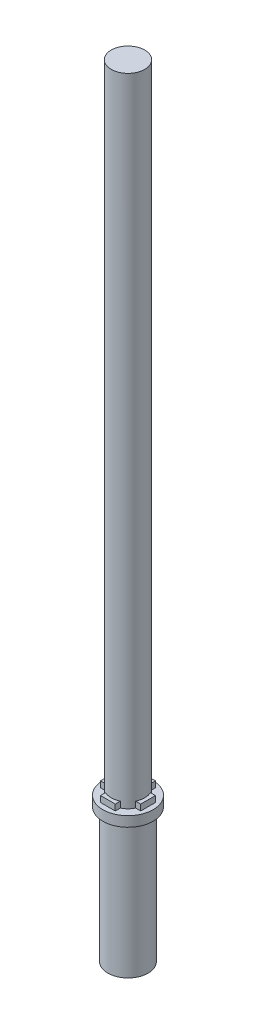
ISO-10303-21;
HEADER;
FILE_DESCRIPTION(('STEP AP214'),'2;1');
FILE_NAME('part.step','',(''),(''),'','','');
FILE_SCHEMA(('AUTOMOTIVE_DESIGN { 1 0 10303 214 1 1 1 1 }'));
ENDSEC;
DATA;
#1=APPLICATION_CONTEXT('core data for automotive mechanical design processes');
#2=APPLICATION_PROTOCOL_DEFINITION('international standard','automotive_design',2000,#1);
#3=PRODUCT_CONTEXT('',#1,'mechanical');
#4=PRODUCT('Part','Part','',(#3));
#5=PRODUCT_RELATED_PRODUCT_CATEGORY('part','',(#4));
#6=PRODUCT_DEFINITION_FORMATION('','',#4);
#7=PRODUCT_DEFINITION_CONTEXT('part definition',#1,'design');
#8=PRODUCT_DEFINITION('design','',#6,#7);
#9=PRODUCT_DEFINITION_SHAPE('','',#8);
#10=(LENGTH_UNIT() NAMED_UNIT(*) SI_UNIT(.MILLI.,.METRE.));
#11=(NAMED_UNIT(*) PLANE_ANGLE_UNIT() SI_UNIT($,.RADIAN.));
#12=(NAMED_UNIT(*) SI_UNIT($,.STERADIAN.) SOLID_ANGLE_UNIT());
#13=UNCERTAINTY_MEASURE_WITH_UNIT(LENGTH_MEASURE(1.E-05),#10,'distance_accuracy_value','');
#14=(GEOMETRIC_REPRESENTATION_CONTEXT(3) GLOBAL_UNCERTAINTY_ASSIGNED_CONTEXT((#13)) GLOBAL_UNIT_ASSIGNED_CONTEXT((#10,
#11,#12)) REPRESENTATION_CONTEXT('',''));
#15=CARTESIAN_POINT('',(0.,0.,0.));
#16=DIRECTION('',(0.,0.,1.));
#17=DIRECTION('',(1.,0.,0.));
#18=AXIS2_PLACEMENT_3D('',#15,#16,#17);
#19=CARTESIAN_POINT('',(0.,0.,0.));
#20=DIRECTION('',(0.,1.,0.));
#21=DIRECTION('',(0.,0.,1.));
#22=AXIS2_PLACEMENT_3D('',#19,#20,#21);
#23=PLANE('',#22);
#24=CARTESIAN_POINT('',(0.,0.,0.));
#25=DIRECTION('',(0.,1.,0.));
#26=DIRECTION('',(0.,0.,1.));
#27=AXIS2_PLACEMENT_3D('',#24,#25,#26);
#28=CIRCLE('',#27,6.);
#29=CARTESIAN_POINT('',(0.,0.,6.));
#30=VERTEX_POINT('',#29);
#31=EDGE_CURVE('E57',#30,#30,#28,.T.);
#32=ORIENTED_EDGE('',*,*,#31,.F.);
#33=EDGE_LOOP('',(#32));
#34=FACE_BOUND('',#33,.T.);
#35=CARTESIAN_POINT('',(0.,0.,0.));
#36=DIRECTION('',(0.,1.,0.));
#37=DIRECTION('',(0.,0.,1.));
#38=AXIS2_PLACEMENT_3D('',#35,#36,#37);
#39=CIRCLE('',#38,5.25);
#40=CARTESIAN_POINT('',(0.,0.,5.25));
#41=VERTEX_POINT('',#40);
#42=EDGE_CURVE('E352',#41,#41,#39,.T.);
#43=ORIENTED_EDGE('',*,*,#42,.T.);
#44=EDGE_LOOP('',(#43));
#45=FACE_BOUND('',#44,.T.);
#46=ADVANCED_FACE('F53',(#34,#45),#23,.F.);
#47=CARTESIAN_POINT('',(0.,40.,0.));
#48=DIRECTION('',(0.,-1.,0.));
#49=DIRECTION('',(0.,0.,-1.));
#50=AXIS2_PLACEMENT_3D('',#47,#48,#49);
#51=CYLINDRICAL_SURFACE('',#50,6.);
#52=CARTESIAN_POINT('',(0.,40.,0.));
#53=DIRECTION('',(0.,1.,0.));
#54=DIRECTION('',(0.,0.,1.));
#55=AXIS2_PLACEMENT_3D('',#52,#53,#54);
#56=CIRCLE('',#55,6.);
#57=CARTESIAN_POINT('',(0.,40.,6.));
#58=VERTEX_POINT('',#57);
#59=EDGE_CURVE('E355',#58,#58,#56,.T.);
#60=ORIENTED_EDGE('',*,*,#59,.F.);
#61=EDGE_LOOP('',(#60));
#62=FACE_BOUND('',#61,.T.);
#63=ORIENTED_EDGE('',*,*,#31,.T.);
#64=EDGE_LOOP('',(#63));
#65=FACE_BOUND('',#64,.T.);
#66=ADVANCED_FACE('F55',(#62,#65),#51,.T.);
#67=CARTESIAN_POINT('',(0.,40.,0.));
#68=DIRECTION('',(0.,-1.,0.));
#69=DIRECTION('',(0.,0.,-1.));
#70=AXIS2_PLACEMENT_3D('',#67,#68,#69);
#71=CYLINDRICAL_SURFACE('',#70,5.25);
#72=CARTESIAN_POINT('',(0.,40.,0.));
#73=DIRECTION('',(0.,1.,0.));
#74=DIRECTION('',(0.,0.,1.));
#75=AXIS2_PLACEMENT_3D('',#72,#73,#74);
#76=CIRCLE('',#75,5.25);
#77=CARTESIAN_POINT('',(0.,40.,5.25));
#78=VERTEX_POINT('',#77);
#79=EDGE_CURVE('E345',#78,#78,#76,.T.);
#80=ORIENTED_EDGE('',*,*,#79,.T.);
#81=EDGE_LOOP('',(#80));
#82=FACE_BOUND('',#81,.T.);
#83=ORIENTED_EDGE('',*,*,#42,.F.);
#84=EDGE_LOOP('',(#83));
#85=FACE_BOUND('',#84,.T.);
#86=ADVANCED_FACE('F372',(#82,#85),#71,.F.);
#87=CARTESIAN_POINT('',(0.,40.,0.));
#88=DIRECTION('',(0.,1.,0.));
#89=DIRECTION('',(0.,0.,1.));
#90=AXIS2_PLACEMENT_3D('',#87,#88,#89);
#91=PLANE('',#90);
#92=ORIENTED_EDGE('',*,*,#79,.F.);
#93=EDGE_LOOP('',(#92));
#94=FACE_BOUND('',#93,.T.);
#95=ADVANCED_FACE('F374',(#94),#91,.F.);
#96=CARTESIAN_POINT('',(0.,43.,0.));
#97=DIRECTION('',(0.,-1.,0.));
#98=DIRECTION('',(0.,0.,-1.));
#99=AXIS2_PLACEMENT_3D('',#96,#97,#98);
#100=CYLINDRICAL_SURFACE('',#99,7.5);
#101=CARTESIAN_POINT('',(0.,43.,0.));
#102=DIRECTION('',(0.,1.,0.));
#103=DIRECTION('',(0.,0.,1.));
#104=AXIS2_PLACEMENT_3D('',#101,#102,#103);
#105=CIRCLE('',#104,7.5);
#106=CARTESIAN_POINT('',(0.,43.,7.5));
#107=VERTEX_POINT('',#106);
#108=EDGE_CURVE('E341',#107,#107,#105,.T.);
#109=ORIENTED_EDGE('',*,*,#108,.F.);
#110=EDGE_LOOP('',(#109));
#111=FACE_BOUND('',#110,.T.);
#112=CARTESIAN_POINT('',(0.,40.,0.));
#113=DIRECTION('',(0.,1.,0.));
#114=DIRECTION('',(0.,0.,1.));
#115=AXIS2_PLACEMENT_3D('',#112,#113,#114);
#116=CIRCLE('',#115,7.5);
#117=CARTESIAN_POINT('',(0.,40.,7.5));
#118=VERTEX_POINT('',#117);
#119=EDGE_CURVE('E339',#118,#118,#116,.T.);
#120=ORIENTED_EDGE('',*,*,#119,.T.);
#121=EDGE_LOOP('',(#120));
#122=FACE_BOUND('',#121,.T.);
#123=ADVANCED_FACE('F381',(#111,#122),#100,.T.);
#124=CARTESIAN_POINT('',(0.,43.,0.));
#125=DIRECTION('',(0.,1.,0.));
#126=DIRECTION('',(0.,0.,1.));
#127=AXIS2_PLACEMENT_3D('',#124,#125,#126);
#128=PLANE('',#127);
#129=DIRECTION('',(-1.,0.,0.));
#130=VECTOR('',#129,1.);
#131=CARTESIAN_POINT('',(0.,43.,2.2));
#132=LINE('',#131,#130);
#133=CARTESIAN_POINT('',(6.,43.,2.2));
#134=VERTEX_POINT('',#133);
#135=CARTESIAN_POINT('',(4.48998886412873,43.,2.2));
#136=VERTEX_POINT('',#135);
#137=EDGE_CURVE('E178',#134,#136,#132,.T.);
#138=ORIENTED_EDGE('',*,*,#137,.T.);
#139=CARTESIAN_POINT('',(0.,43.,0.));
#140=DIRECTION('',(0.,1.,0.));
#141=DIRECTION('',(0.,0.,1.));
#142=AXIS2_PLACEMENT_3D('',#139,#140,#141);
#143=CIRCLE('',#142,5.);
#144=CARTESIAN_POINT('',(2.2,43.,4.48998886412873));
#145=VERTEX_POINT('',#144);
#146=EDGE_CURVE('E12',#145,#136,#143,.T.);
#147=ORIENTED_EDGE('',*,*,#146,.F.);
#148=DIRECTION('',(0.,0.,1.));
#149=VECTOR('',#148,1.);
#150=CARTESIAN_POINT('',(2.2,43.,0.));
#151=LINE('',#150,#149);
#152=CARTESIAN_POINT('',(2.2,43.,6.));
#153=VERTEX_POINT('',#152);
#154=EDGE_CURVE('E225',#145,#153,#151,.T.);
#155=ORIENTED_EDGE('',*,*,#154,.T.);
#156=DIRECTION('',(-1.,0.,0.));
#157=VECTOR('',#156,1.);
#158=CARTESIAN_POINT('',(0.,43.,6.));
#159=LINE('',#158,#157);
#160=CARTESIAN_POINT('',(-2.2,43.,6.));
#161=VERTEX_POINT('',#160);
#162=EDGE_CURVE('E239',#153,#161,#159,.T.);
#163=ORIENTED_EDGE('',*,*,#162,.T.);
#164=DIRECTION('',(0.,0.,-1.));
#165=VECTOR('',#164,1.);
#166=CARTESIAN_POINT('',(-2.2,43.,0.));
#167=LINE('',#166,#165);
#168=CARTESIAN_POINT('',(-2.2,43.,4.48998886412873));
#169=VERTEX_POINT('',#168);
#170=EDGE_CURVE('E235',#161,#169,#167,.T.);
#171=ORIENTED_EDGE('',*,*,#170,.T.);
#172=CARTESIAN_POINT('',(-4.48998886412873,43.,2.2));
#173=VERTEX_POINT('',#172);
#174=EDGE_CURVE('E65',#173,#169,#143,.T.);
#175=ORIENTED_EDGE('',*,*,#174,.F.);
#176=DIRECTION('',(-1.,0.,0.));
#177=VECTOR('',#176,1.);
#178=CARTESIAN_POINT('',(0.,43.,2.2));
#179=LINE('',#178,#177);
#180=CARTESIAN_POINT('',(-6.,43.,2.2));
#181=VERTEX_POINT('',#180);
#182=EDGE_CURVE('E303',#173,#181,#179,.T.);
#183=ORIENTED_EDGE('',*,*,#182,.T.);
#184=DIRECTION('',(0.,0.,-1.));
#185=VECTOR('',#184,1.);
#186=CARTESIAN_POINT('',(-6.,43.,0.));
#187=LINE('',#186,#185);
#188=CARTESIAN_POINT('',(-6.,43.,-2.2));
#189=VERTEX_POINT('',#188);
#190=EDGE_CURVE('E319',#181,#189,#187,.T.);
#191=ORIENTED_EDGE('',*,*,#190,.T.);
#192=DIRECTION('',(1.,0.,0.));
#193=VECTOR('',#192,1.);
#194=CARTESIAN_POINT('',(0.,43.,-2.2));
#195=LINE('',#194,#193);
#196=CARTESIAN_POINT('',(-4.48998886412873,43.,-2.2));
#197=VERTEX_POINT('',#196);
#198=EDGE_CURVE('E315',#189,#197,#195,.T.);
#199=ORIENTED_EDGE('',*,*,#198,.T.);
#200=CARTESIAN_POINT('',(-2.2,43.,-4.48998886412873));
#201=VERTEX_POINT('',#200);
#202=EDGE_CURVE('E363',#201,#197,#143,.T.);
#203=ORIENTED_EDGE('',*,*,#202,.F.);
#204=DIRECTION('',(0.,0.,-1.));
#205=VECTOR('',#204,1.);
#206=CARTESIAN_POINT('',(-2.2,43.,0.));
#207=LINE('',#206,#205);
#208=CARTESIAN_POINT('',(-2.2,43.,-6.));
#209=VERTEX_POINT('',#208);
#210=EDGE_CURVE('E263',#201,#209,#207,.T.);
#211=ORIENTED_EDGE('',*,*,#210,.T.);
#212=DIRECTION('',(1.,0.,0.));
#213=VECTOR('',#212,1.);
#214=CARTESIAN_POINT('',(0.,43.,-6.));
#215=LINE('',#214,#213);
#216=CARTESIAN_POINT('',(2.2,43.,-6.));
#217=VERTEX_POINT('',#216);
#218=EDGE_CURVE('E279',#209,#217,#215,.T.);
#219=ORIENTED_EDGE('',*,*,#218,.T.);
#220=DIRECTION('',(0.,0.,1.));
#221=VECTOR('',#220,1.);
#222=CARTESIAN_POINT('',(2.2,43.,0.));
#223=LINE('',#222,#221);
#224=CARTESIAN_POINT('',(2.2,43.,-4.48998886412873));
#225=VERTEX_POINT('',#224);
#226=EDGE_CURVE('E275',#217,#225,#223,.T.);
#227=ORIENTED_EDGE('',*,*,#226,.T.);
#228=CARTESIAN_POINT('',(4.48998886412873,43.,-2.2));
#229=VERTEX_POINT('',#228);
#230=EDGE_CURVE('E63',#229,#225,#143,.T.);
#231=ORIENTED_EDGE('',*,*,#230,.F.);
#232=DIRECTION('',(1.,0.,0.));
#233=VECTOR('',#232,1.);
#234=CARTESIAN_POINT('',(0.,43.,-2.2));
#235=LINE('',#234,#233);
#236=CARTESIAN_POINT('',(6.,43.,-2.2));
#237=VERTEX_POINT('',#236);
#238=EDGE_CURVE('E192',#229,#237,#235,.T.);
#239=ORIENTED_EDGE('',*,*,#238,.T.);
#240=DIRECTION('',(0.,0.,1.));
#241=VECTOR('',#240,1.);
#242=CARTESIAN_POINT('',(6.,43.,0.));
#243=LINE('',#242,#241);
#244=EDGE_CURVE('E205',#237,#134,#243,.T.);
#245=ORIENTED_EDGE('',*,*,#244,.T.);
#246=EDGE_LOOP('',(#138,#147,#155,#163,#171,#175,#183,#191,#199,#203,#211,#219,#227,#231,#239,#245));
#247=FACE_BOUND('',#246,.T.);
#248=ORIENTED_EDGE('',*,*,#108,.T.);
#249=EDGE_LOOP('',(#248));
#250=FACE_BOUND('',#249,.T.);
#251=ADVANCED_FACE('F388',(#247,#250),#128,.T.);
#252=ORIENTED_EDGE('',*,*,#59,.T.);
#253=EDGE_LOOP('',(#252));
#254=FACE_BOUND('',#253,.T.);
#255=ORIENTED_EDGE('',*,*,#119,.F.);
#256=EDGE_LOOP('',(#255));
#257=FACE_BOUND('',#256,.T.);
#258=ADVANCED_FACE('F384',(#254,#257),#91,.F.);
#259=CARTESIAN_POINT('',(0.,233.,0.));
#260=DIRECTION('',(0.,-1.,0.));
#261=DIRECTION('',(0.,0.,-1.));
#262=AXIS2_PLACEMENT_3D('',#259,#260,#261);
#263=CYLINDRICAL_SURFACE('',#262,5.);
#264=ORIENTED_EDGE('',*,*,#146,.T.);
#265=DIRECTION('',(0.,-1.,0.));
#266=VECTOR('',#265,1.);
#267=CARTESIAN_POINT('',(4.48998886412873,44.8,2.2));
#268=LINE('',#267,#266);
#269=CARTESIAN_POINT('',(4.48998886412873,44.8,2.2));
#270=VERTEX_POINT('',#269);
#271=EDGE_CURVE('E202',#270,#136,#268,.T.);
#272=ORIENTED_EDGE('',*,*,#271,.F.);
#273=CARTESIAN_POINT('',(0.,44.8,0.));
#274=DIRECTION('',(0.,1.,0.));
#275=DIRECTION('',(0.,0.,1.));
#276=AXIS2_PLACEMENT_3D('',#273,#274,#275);
#277=CIRCLE('',#276,5.);
#278=CARTESIAN_POINT('',(4.48998886412873,44.8,-2.2));
#279=VERTEX_POINT('',#278);
#280=EDGE_CURVE('E190',#279,#270,#277,.F.);
#281=ORIENTED_EDGE('',*,*,#280,.F.);
#282=DIRECTION('',(0.,-1.,0.));
#283=VECTOR('',#282,1.);
#284=CARTESIAN_POINT('',(4.48998886412873,44.8,-2.2));
#285=LINE('',#284,#283);
#286=EDGE_CURVE('E214',#279,#229,#285,.T.);
#287=ORIENTED_EDGE('',*,*,#286,.T.);
#288=ORIENTED_EDGE('',*,*,#230,.T.);
#289=DIRECTION('',(0.,-1.,0.));
#290=VECTOR('',#289,1.);
#291=CARTESIAN_POINT('',(2.2,44.8,-4.48998886412873));
#292=LINE('',#291,#290);
#293=CARTESIAN_POINT('',(2.2,44.8,-4.48998886412873));
#294=VERTEX_POINT('',#293);
#295=EDGE_CURVE('E274',#294,#225,#292,.T.);
#296=ORIENTED_EDGE('',*,*,#295,.F.);
#297=CARTESIAN_POINT('',(0.,44.8,0.));
#298=DIRECTION('',(0.,1.,0.));
#299=DIRECTION('',(0.,0.,1.));
#300=AXIS2_PLACEMENT_3D('',#297,#298,#299);
#301=CIRCLE('',#300,5.);
#302=CARTESIAN_POINT('',(-2.2,44.8,-4.48998886412873));
#303=VERTEX_POINT('',#302);
#304=EDGE_CURVE('E271',#303,#294,#301,.F.);
#305=ORIENTED_EDGE('',*,*,#304,.F.);
#306=DIRECTION('',(0.,-1.,0.));
#307=VECTOR('',#306,1.);
#308=CARTESIAN_POINT('',(-2.2,44.8,-4.48998886412873));
#309=LINE('',#308,#307);
#310=EDGE_CURVE('E289',#303,#201,#309,.T.);
#311=ORIENTED_EDGE('',*,*,#310,.T.);
#312=ORIENTED_EDGE('',*,*,#202,.T.);
#313=DIRECTION('',(0.,-1.,0.));
#314=VECTOR('',#313,1.);
#315=CARTESIAN_POINT('',(-4.48998886412873,44.8,-2.2));
#316=LINE('',#315,#314);
#317=CARTESIAN_POINT('',(-4.48998886412873,44.8,-2.2));
#318=VERTEX_POINT('',#317);
#319=EDGE_CURVE('E314',#318,#197,#316,.T.);
#320=ORIENTED_EDGE('',*,*,#319,.F.);
#321=CARTESIAN_POINT('',(0.,44.8,0.));
#322=DIRECTION('',(0.,1.,0.));
#323=DIRECTION('',(0.,0.,1.));
#324=AXIS2_PLACEMENT_3D('',#321,#322,#323);
#325=CIRCLE('',#324,5.);
#326=CARTESIAN_POINT('',(-4.48998886412873,44.8,2.2));
#327=VERTEX_POINT('',#326);
#328=EDGE_CURVE('E311',#327,#318,#325,.F.);
#329=ORIENTED_EDGE('',*,*,#328,.F.);
#330=DIRECTION('',(0.,-1.,0.));
#331=VECTOR('',#330,1.);
#332=CARTESIAN_POINT('',(-4.48998886412873,44.8,2.2));
#333=LINE('',#332,#331);
#334=EDGE_CURVE('E328',#327,#173,#333,.T.);
#335=ORIENTED_EDGE('',*,*,#334,.T.);
#336=ORIENTED_EDGE('',*,*,#174,.T.);
#337=DIRECTION('',(0.,-1.,0.));
#338=VECTOR('',#337,1.);
#339=CARTESIAN_POINT('',(-2.2,44.8,4.48998886412873));
#340=LINE('',#339,#338);
#341=CARTESIAN_POINT('',(-2.2,44.8,4.48998886412873));
#342=VERTEX_POINT('',#341);
#343=EDGE_CURVE('E234',#342,#169,#340,.T.);
#344=ORIENTED_EDGE('',*,*,#343,.F.);
#345=CARTESIAN_POINT('',(0.,44.8,0.));
#346=DIRECTION('',(0.,1.,0.));
#347=DIRECTION('',(0.,0.,1.));
#348=AXIS2_PLACEMENT_3D('',#345,#346,#347);
#349=CIRCLE('',#348,5.);
#350=CARTESIAN_POINT('',(2.2,44.8,4.48998886412873));
#351=VERTEX_POINT('',#350);
#352=EDGE_CURVE('E231',#351,#342,#349,.F.);
#353=ORIENTED_EDGE('',*,*,#352,.F.);
#354=DIRECTION('',(0.,-1.,0.));
#355=VECTOR('',#354,1.);
#356=CARTESIAN_POINT('',(2.2,44.8,4.48998886412873));
#357=LINE('',#356,#355);
#358=EDGE_CURVE('E249',#351,#145,#357,.T.);
#359=ORIENTED_EDGE('',*,*,#358,.T.);
#360=EDGE_LOOP('',(#264,#272,#281,#287,#288,#296,#305,#311,#312,#320,#329,#335,#336,#344,#353,#359));
#361=FACE_BOUND('',#360,.T.);
#362=CARTESIAN_POINT('',(0.,233.,0.));
#363=DIRECTION('',(0.,1.,0.));
#364=DIRECTION('',(0.,0.,1.));
#365=AXIS2_PLACEMENT_3D('',#362,#363,#364);
#366=CIRCLE('',#365,5.);
#367=CARTESIAN_POINT('',(0.,233.,5.));
#368=VERTEX_POINT('',#367);
#369=EDGE_CURVE('E184',#368,#368,#366,.T.);
#370=ORIENTED_EDGE('',*,*,#369,.F.);
#371=EDGE_LOOP('',(#370));
#372=FACE_BOUND('',#371,.T.);
#373=ADVANCED_FACE('F392',(#361,#372),#263,.T.);
#374=CARTESIAN_POINT('',(0.,233.,0.));
#375=DIRECTION('',(0.,1.,0.));
#376=DIRECTION('',(0.,0.,1.));
#377=AXIS2_PLACEMENT_3D('',#374,#375,#376);
#378=PLANE('',#377);
#379=ORIENTED_EDGE('',*,*,#369,.T.);
#380=EDGE_LOOP('',(#379));
#381=FACE_BOUND('',#380,.T.);
#382=ADVANCED_FACE('F398',(#381),#378,.T.);
#383=CARTESIAN_POINT('',(0.,44.8,-2.2));
#384=DIRECTION('',(0.,0.,-1.));
#385=DIRECTION('',(-1.,0.,0.));
#386=AXIS2_PLACEMENT_3D('',#383,#384,#385);
#387=PLANE('',#386);
#388=ORIENTED_EDGE('',*,*,#198,.F.);
#389=DIRECTION('',(0.,-1.,0.));
#390=VECTOR('',#389,1.);
#391=CARTESIAN_POINT('',(-6.,44.8,-2.2));
#392=LINE('',#391,#390);
#393=CARTESIAN_POINT('',(-6.,44.8,-2.2));
#394=VERTEX_POINT('',#393);
#395=EDGE_CURVE('E280',#394,#189,#392,.T.);
#396=ORIENTED_EDGE('',*,*,#395,.F.);
#397=DIRECTION('',(1.,0.,0.));
#398=VECTOR('',#397,1.);
#399=CARTESIAN_POINT('',(0.,44.8,-2.2));
#400=LINE('',#399,#398);
#401=EDGE_CURVE('E298',#394,#318,#400,.T.);
#402=ORIENTED_EDGE('',*,*,#401,.T.);
#403=ORIENTED_EDGE('',*,*,#319,.T.);
#404=EDGE_LOOP('',(#388,#396,#402,#403));
#405=FACE_BOUND('',#404,.T.);
#406=ADVANCED_FACE('F402',(#405),#387,.T.);
#407=CARTESIAN_POINT('',(-6.,44.8,0.));
#408=DIRECTION('',(-1.,0.,0.));
#409=DIRECTION('',(0.,0.,1.));
#410=AXIS2_PLACEMENT_3D('',#407,#408,#409);
#411=PLANE('',#410);
#412=ORIENTED_EDGE('',*,*,#190,.F.);
#413=DIRECTION('',(0.,-1.,0.));
#414=VECTOR('',#413,1.);
#415=CARTESIAN_POINT('',(-6.,44.8,2.2));
#416=LINE('',#415,#414);
#417=CARTESIAN_POINT('',(-6.,44.8,2.2));
#418=VERTEX_POINT('',#417);
#419=EDGE_CURVE('E332',#418,#181,#416,.T.);
#420=ORIENTED_EDGE('',*,*,#419,.F.);
#421=DIRECTION('',(0.,0.,-1.));
#422=VECTOR('',#421,1.);
#423=CARTESIAN_POINT('',(-6.,44.8,0.));
#424=LINE('',#423,#422);
#425=EDGE_CURVE('E302',#418,#394,#424,.T.);
#426=ORIENTED_EDGE('',*,*,#425,.T.);
#427=ORIENTED_EDGE('',*,*,#395,.T.);
#428=EDGE_LOOP('',(#412,#420,#426,#427));
#429=FACE_BOUND('',#428,.T.);
#430=ADVANCED_FACE('F406',(#429),#411,.T.);
#431=CARTESIAN_POINT('',(0.,44.8,2.2));
#432=DIRECTION('',(0.,0.,1.));
#433=DIRECTION('',(1.,0.,0.));
#434=AXIS2_PLACEMENT_3D('',#431,#432,#433);
#435=PLANE('',#434);
#436=ORIENTED_EDGE('',*,*,#182,.F.);
#437=ORIENTED_EDGE('',*,*,#334,.F.);
#438=DIRECTION('',(-1.,0.,0.));
#439=VECTOR('',#438,1.);
#440=CARTESIAN_POINT('',(0.,44.8,2.2));
#441=LINE('',#440,#439);
#442=EDGE_CURVE('E307',#327,#418,#441,.T.);
#443=ORIENTED_EDGE('',*,*,#442,.T.);
#444=ORIENTED_EDGE('',*,*,#419,.T.);
#445=EDGE_LOOP('',(#436,#437,#443,#444));
#446=FACE_BOUND('',#445,.T.);
#447=ADVANCED_FACE('F410',(#446),#435,.T.);
#448=CARTESIAN_POINT('',(0.,44.8,0.));
#449=DIRECTION('',(0.,1.,0.));
#450=DIRECTION('',(0.,0.,1.));
#451=AXIS2_PLACEMENT_3D('',#448,#449,#450);
#452=PLANE('',#451);
#453=ORIENTED_EDGE('',*,*,#401,.F.);
#454=ORIENTED_EDGE('',*,*,#425,.F.);
#455=ORIENTED_EDGE('',*,*,#442,.F.);
#456=ORIENTED_EDGE('',*,*,#328,.T.);
#457=EDGE_LOOP('',(#453,#454,#455,#456));
#458=FACE_BOUND('',#457,.T.);
#459=ADVANCED_FACE('F414',(#458),#452,.T.);
#460=CARTESIAN_POINT('',(2.2,44.8,0.));
#461=DIRECTION('',(1.,0.,0.));
#462=DIRECTION('',(0.,0.,-1.));
#463=AXIS2_PLACEMENT_3D('',#460,#461,#462);
#464=PLANE('',#463);
#465=ORIENTED_EDGE('',*,*,#226,.F.);
#466=DIRECTION('',(0.,-1.,0.));
#467=VECTOR('',#466,1.);
#468=CARTESIAN_POINT('',(2.2,44.8,-6.));
#469=LINE('',#468,#467);
#470=CARTESIAN_POINT('',(2.2,44.8,-6.));
#471=VERTEX_POINT('',#470);
#472=EDGE_CURVE('E240',#471,#217,#469,.T.);
#473=ORIENTED_EDGE('',*,*,#472,.F.);
#474=DIRECTION('',(0.,0.,1.));
#475=VECTOR('',#474,1.);
#476=CARTESIAN_POINT('',(2.2,44.8,0.));
#477=LINE('',#476,#475);
#478=EDGE_CURVE('E258',#471,#294,#477,.T.);
#479=ORIENTED_EDGE('',*,*,#478,.T.);
#480=ORIENTED_EDGE('',*,*,#295,.T.);
#481=EDGE_LOOP('',(#465,#473,#479,#480));
#482=FACE_BOUND('',#481,.T.);
#483=ADVANCED_FACE('F418',(#482),#464,.T.);
#484=CARTESIAN_POINT('',(0.,44.8,-6.));
#485=DIRECTION('',(0.,0.,-1.));
#486=DIRECTION('',(-1.,0.,0.));
#487=AXIS2_PLACEMENT_3D('',#484,#485,#486);
#488=PLANE('',#487);
#489=ORIENTED_EDGE('',*,*,#218,.F.);
#490=DIRECTION('',(0.,-1.,0.));
#491=VECTOR('',#490,1.);
#492=CARTESIAN_POINT('',(-2.2,44.8,-6.));
#493=LINE('',#492,#491);
#494=CARTESIAN_POINT('',(-2.2,44.8,-6.));
#495=VERTEX_POINT('',#494);
#496=EDGE_CURVE('E293',#495,#209,#493,.T.);
#497=ORIENTED_EDGE('',*,*,#496,.F.);
#498=DIRECTION('',(1.,0.,0.));
#499=VECTOR('',#498,1.);
#500=CARTESIAN_POINT('',(0.,44.8,-6.));
#501=LINE('',#500,#499);
#502=EDGE_CURVE('E262',#495,#471,#501,.T.);
#503=ORIENTED_EDGE('',*,*,#502,.T.);
#504=ORIENTED_EDGE('',*,*,#472,.T.);
#505=EDGE_LOOP('',(#489,#497,#503,#504));
#506=FACE_BOUND('',#505,.T.);
#507=ADVANCED_FACE('F422',(#506),#488,.T.);
#508=CARTESIAN_POINT('',(-2.2,44.8,0.));
#509=DIRECTION('',(-1.,0.,0.));
#510=DIRECTION('',(0.,0.,1.));
#511=AXIS2_PLACEMENT_3D('',#508,#509,#510);
#512=PLANE('',#511);
#513=ORIENTED_EDGE('',*,*,#210,.F.);
#514=ORIENTED_EDGE('',*,*,#310,.F.);
#515=DIRECTION('',(0.,0.,-1.));
#516=VECTOR('',#515,1.);
#517=CARTESIAN_POINT('',(-2.2,44.8,0.));
#518=LINE('',#517,#516);
#519=EDGE_CURVE('E267',#303,#495,#518,.T.);
#520=ORIENTED_EDGE('',*,*,#519,.T.);
#521=ORIENTED_EDGE('',*,*,#496,.T.);
#522=EDGE_LOOP('',(#513,#514,#520,#521));
#523=FACE_BOUND('',#522,.T.);
#524=ADVANCED_FACE('F426',(#523),#512,.T.);
#525=CARTESIAN_POINT('',(0.,44.8,0.));
#526=DIRECTION('',(0.,1.,0.));
#527=DIRECTION('',(0.,0.,1.));
#528=AXIS2_PLACEMENT_3D('',#525,#526,#527);
#529=PLANE('',#528);
#530=ORIENTED_EDGE('',*,*,#478,.F.);
#531=ORIENTED_EDGE('',*,*,#502,.F.);
#532=ORIENTED_EDGE('',*,*,#519,.F.);
#533=ORIENTED_EDGE('',*,*,#304,.T.);
#534=EDGE_LOOP('',(#530,#531,#532,#533));
#535=FACE_BOUND('',#534,.T.);
#536=ADVANCED_FACE('F430',(#535),#529,.T.);
#537=CARTESIAN_POINT('',(-2.2,44.8,0.));
#538=DIRECTION('',(-1.,0.,0.));
#539=DIRECTION('',(0.,0.,1.));
#540=AXIS2_PLACEMENT_3D('',#537,#538,#539);
#541=PLANE('',#540);
#542=ORIENTED_EDGE('',*,*,#170,.F.);
#543=DIRECTION('',(0.,-1.,0.));
#544=VECTOR('',#543,1.);
#545=CARTESIAN_POINT('',(-2.2,44.8,6.));
#546=LINE('',#545,#544);
#547=CARTESIAN_POINT('',(-2.2,44.8,6.));
#548=VERTEX_POINT('',#547);
#549=EDGE_CURVE('E206',#548,#161,#546,.T.);
#550=ORIENTED_EDGE('',*,*,#549,.F.);
#551=DIRECTION('',(0.,0.,-1.));
#552=VECTOR('',#551,1.);
#553=CARTESIAN_POINT('',(-2.2,44.8,0.));
#554=LINE('',#553,#552);
#555=EDGE_CURVE('E220',#548,#342,#554,.T.);
#556=ORIENTED_EDGE('',*,*,#555,.T.);
#557=ORIENTED_EDGE('',*,*,#343,.T.);
#558=EDGE_LOOP('',(#542,#550,#556,#557));
#559=FACE_BOUND('',#558,.T.);
#560=ADVANCED_FACE('F434',(#559),#541,.T.);
#561=CARTESIAN_POINT('',(0.,44.8,6.));
#562=DIRECTION('',(0.,0.,1.));
#563=DIRECTION('',(1.,0.,0.));
#564=AXIS2_PLACEMENT_3D('',#561,#562,#563);
#565=PLANE('',#564);
#566=ORIENTED_EDGE('',*,*,#162,.F.);
#567=DIRECTION('',(0.,-1.,0.));
#568=VECTOR('',#567,1.);
#569=CARTESIAN_POINT('',(2.2,44.8,6.));
#570=LINE('',#569,#568);
#571=CARTESIAN_POINT('',(2.2,44.8,6.));
#572=VERTEX_POINT('',#571);
#573=EDGE_CURVE('E253',#572,#153,#570,.T.);
#574=ORIENTED_EDGE('',*,*,#573,.F.);
#575=DIRECTION('',(-1.,0.,0.));
#576=VECTOR('',#575,1.);
#577=CARTESIAN_POINT('',(0.,44.8,6.));
#578=LINE('',#577,#576);
#579=EDGE_CURVE('E224',#572,#548,#578,.T.);
#580=ORIENTED_EDGE('',*,*,#579,.T.);
#581=ORIENTED_EDGE('',*,*,#549,.T.);
#582=EDGE_LOOP('',(#566,#574,#580,#581));
#583=FACE_BOUND('',#582,.T.);
#584=ADVANCED_FACE('F438',(#583),#565,.T.);
#585=CARTESIAN_POINT('',(2.2,44.8,0.));
#586=DIRECTION('',(1.,0.,0.));
#587=DIRECTION('',(0.,0.,-1.));
#588=AXIS2_PLACEMENT_3D('',#585,#586,#587);
#589=PLANE('',#588);
#590=ORIENTED_EDGE('',*,*,#154,.F.);
#591=ORIENTED_EDGE('',*,*,#358,.F.);
#592=DIRECTION('',(0.,0.,1.));
#593=VECTOR('',#592,1.);
#594=CARTESIAN_POINT('',(2.2,44.8,0.));
#595=LINE('',#594,#593);
#596=EDGE_CURVE('E80',#351,#572,#595,.T.);
#597=ORIENTED_EDGE('',*,*,#596,.T.);
#598=ORIENTED_EDGE('',*,*,#573,.T.);
#599=EDGE_LOOP('',(#590,#591,#597,#598));
#600=FACE_BOUND('',#599,.T.);
#601=ADVANCED_FACE('F442',(#600),#589,.T.);
#602=CARTESIAN_POINT('',(0.,44.8,0.));
#603=DIRECTION('',(0.,1.,0.));
#604=DIRECTION('',(0.,0.,1.));
#605=AXIS2_PLACEMENT_3D('',#602,#603,#604);
#606=PLANE('',#605);
#607=ORIENTED_EDGE('',*,*,#555,.F.);
#608=ORIENTED_EDGE('',*,*,#579,.F.);
#609=ORIENTED_EDGE('',*,*,#596,.F.);
#610=ORIENTED_EDGE('',*,*,#352,.T.);
#611=EDGE_LOOP('',(#607,#608,#609,#610));
#612=FACE_BOUND('',#611,.T.);
#613=ADVANCED_FACE('F446',(#612),#606,.T.);
#614=CARTESIAN_POINT('',(0.,44.8,2.2));
#615=DIRECTION('',(0.,0.,1.));
#616=DIRECTION('',(1.,0.,0.));
#617=AXIS2_PLACEMENT_3D('',#614,#615,#616);
#618=PLANE('',#617);
#619=ORIENTED_EDGE('',*,*,#137,.F.);
#620=DIRECTION('',(0.,-1.,0.));
#621=VECTOR('',#620,1.);
#622=CARTESIAN_POINT('',(6.,44.8,2.2));
#623=LINE('',#622,#621);
#624=CARTESIAN_POINT('',(6.,44.8,2.2));
#625=VERTEX_POINT('',#624);
#626=EDGE_CURVE('E172',#625,#134,#623,.T.);
#627=ORIENTED_EDGE('',*,*,#626,.F.);
#628=DIRECTION('',(-1.,0.,0.));
#629=VECTOR('',#628,1.);
#630=CARTESIAN_POINT('',(0.,44.8,2.2));
#631=LINE('',#630,#629);
#632=EDGE_CURVE('E175',#625,#270,#631,.T.);
#633=ORIENTED_EDGE('',*,*,#632,.T.);
#634=ORIENTED_EDGE('',*,*,#271,.T.);
#635=EDGE_LOOP('',(#619,#627,#633,#634));
#636=FACE_BOUND('',#635,.T.);
#637=ADVANCED_FACE('F174',(#636),#618,.T.);
#638=CARTESIAN_POINT('',(6.,44.8,0.));
#639=DIRECTION('',(1.,0.,0.));
#640=DIRECTION('',(0.,0.,-1.));
#641=AXIS2_PLACEMENT_3D('',#638,#639,#640);
#642=PLANE('',#641);
#643=ORIENTED_EDGE('',*,*,#244,.F.);
#644=DIRECTION('',(0.,-1.,0.));
#645=VECTOR('',#644,1.);
#646=CARTESIAN_POINT('',(6.,44.8,-2.2));
#647=LINE('',#646,#645);
#648=CARTESIAN_POINT('',(6.,44.8,-2.2));
#649=VERTEX_POINT('',#648);
#650=EDGE_CURVE('E185',#649,#237,#647,.T.);
#651=ORIENTED_EDGE('',*,*,#650,.F.);
#652=DIRECTION('',(0.,0.,1.));
#653=VECTOR('',#652,1.);
#654=CARTESIAN_POINT('',(6.,44.8,0.));
#655=LINE('',#654,#653);
#656=EDGE_CURVE('E188',#649,#625,#655,.T.);
#657=ORIENTED_EDGE('',*,*,#656,.T.);
#658=ORIENTED_EDGE('',*,*,#626,.T.);
#659=EDGE_LOOP('',(#643,#651,#657,#658));
#660=FACE_BOUND('',#659,.T.);
#661=ADVANCED_FACE('F194',(#660),#642,.T.);
#662=CARTESIAN_POINT('',(0.,44.8,-2.2));
#663=DIRECTION('',(0.,0.,-1.));
#664=DIRECTION('',(-1.,0.,0.));
#665=AXIS2_PLACEMENT_3D('',#662,#663,#664);
#666=PLANE('',#665);
#667=ORIENTED_EDGE('',*,*,#238,.F.);
#668=ORIENTED_EDGE('',*,*,#286,.F.);
#669=DIRECTION('',(1.,0.,0.));
#670=VECTOR('',#669,1.);
#671=CARTESIAN_POINT('',(0.,44.8,-2.2));
#672=LINE('',#671,#670);
#673=EDGE_CURVE('E72',#279,#649,#672,.T.);
#674=ORIENTED_EDGE('',*,*,#673,.T.);
#675=ORIENTED_EDGE('',*,*,#650,.T.);
#676=EDGE_LOOP('',(#667,#668,#674,#675));
#677=FACE_BOUND('',#676,.T.);
#678=ADVANCED_FACE('F454',(#677),#666,.T.);
#679=CARTESIAN_POINT('',(0.,44.8,0.));
#680=DIRECTION('',(0.,1.,0.));
#681=DIRECTION('',(0.,0.,1.));
#682=AXIS2_PLACEMENT_3D('',#679,#680,#681);
#683=PLANE('',#682);
#684=ORIENTED_EDGE('',*,*,#632,.F.);
#685=ORIENTED_EDGE('',*,*,#656,.F.);
#686=ORIENTED_EDGE('',*,*,#673,.F.);
#687=ORIENTED_EDGE('',*,*,#280,.T.);
#688=EDGE_LOOP('',(#684,#685,#686,#687));
#689=FACE_BOUND('',#688,.T.);
#690=ADVANCED_FACE('F187',(#689),#683,.T.);
#691=CLOSED_SHELL('',(#46,#66,#86,#95,#123,#251,#258,#373,#382,#406,#430,#447,#459,#483,#507,
#524,#536,#560,#584,#601,#613,#637,#661,#678,#690));
#692=MANIFOLD_SOLID_BREP('B2',#691);
#693=ADVANCED_BREP_SHAPE_REPRESENTATION('',(#18,#692),#14);
#694=SHAPE_DEFINITION_REPRESENTATION(#9,#693);
ENDSEC;
END-ISO-10303-21;
